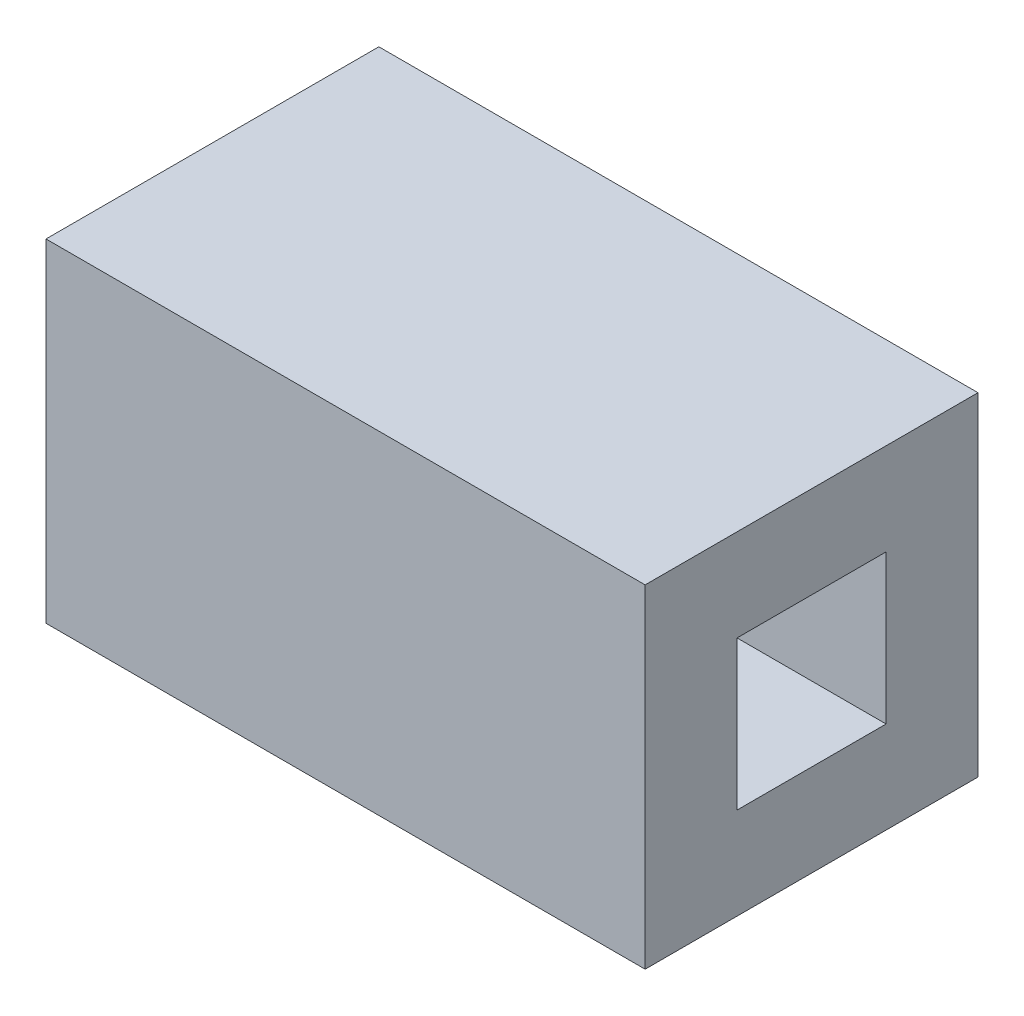
ISO-10303-21;
HEADER;
FILE_DESCRIPTION(('STEP AP214'),'2;1');
FILE_NAME('part.step','',(''),(''),'','','');
FILE_SCHEMA(('AUTOMOTIVE_DESIGN { 1 0 10303 214 1 1 1 1 }'));
ENDSEC;
DATA;
#1=APPLICATION_CONTEXT('core data for automotive mechanical design processes');
#2=APPLICATION_PROTOCOL_DEFINITION('international standard','automotive_design',2000,#1);
#3=PRODUCT_CONTEXT('',#1,'mechanical');
#4=PRODUCT('Part','Part','',(#3));
#5=PRODUCT_RELATED_PRODUCT_CATEGORY('part','',(#4));
#6=PRODUCT_DEFINITION_FORMATION('','',#4);
#7=PRODUCT_DEFINITION_CONTEXT('part definition',#1,'design');
#8=PRODUCT_DEFINITION('design','',#6,#7);
#9=PRODUCT_DEFINITION_SHAPE('','',#8);
#10=(LENGTH_UNIT() NAMED_UNIT(*) SI_UNIT(.MILLI.,.METRE.));
#11=(NAMED_UNIT(*) PLANE_ANGLE_UNIT() SI_UNIT($,.RADIAN.));
#12=(NAMED_UNIT(*) SI_UNIT($,.STERADIAN.) SOLID_ANGLE_UNIT());
#13=UNCERTAINTY_MEASURE_WITH_UNIT(LENGTH_MEASURE(1.E-05),#10,'distance_accuracy_value','');
#14=(GEOMETRIC_REPRESENTATION_CONTEXT(3) GLOBAL_UNCERTAINTY_ASSIGNED_CONTEXT((#13)) GLOBAL_UNIT_ASSIGNED_CONTEXT((#10,
#11,#12)) REPRESENTATION_CONTEXT('',''));
#15=CARTESIAN_POINT('',(0.,0.,0.));
#16=DIRECTION('',(0.,0.,1.));
#17=DIRECTION('',(1.,0.,0.));
#18=AXIS2_PLACEMENT_3D('',#15,#16,#17);
#19=CARTESIAN_POINT('',(-7.,0.,-3.75));
#20=DIRECTION('',(0.,0.,-1.));
#21=DIRECTION('',(-1.,0.,0.));
#22=AXIS2_PLACEMENT_3D('',#19,#20,#21);
#23=PLANE('',#22);
#24=DIRECTION('',(1.,0.,0.));
#25=VECTOR('',#24,1.);
#26=CARTESIAN_POINT('',(-7.,3.75,-3.75));
#27=LINE('',#26,#25);
#28=CARTESIAN_POINT('',(-7.,3.75,-3.75));
#29=VERTEX_POINT('',#28);
#30=CARTESIAN_POINT('',(6.5,3.75,-3.75));
#31=VERTEX_POINT('',#30);
#32=EDGE_CURVE('E50',#29,#31,#27,.T.);
#33=ORIENTED_EDGE('',*,*,#32,.T.);
#34=DIRECTION('',(0.,1.,0.));
#35=VECTOR('',#34,1.);
#36=CARTESIAN_POINT('',(6.5,-3.75,-3.75));
#37=LINE('',#36,#35);
#38=CARTESIAN_POINT('',(6.5,-3.75,-3.75));
#39=VERTEX_POINT('',#38);
#40=EDGE_CURVE('E172',#39,#31,#37,.T.);
#41=ORIENTED_EDGE('',*,*,#40,.F.);
#42=DIRECTION('',(1.,0.,0.));
#43=VECTOR('',#42,1.);
#44=CARTESIAN_POINT('',(-7.,-3.75,-3.75));
#45=LINE('',#44,#43);
#46=CARTESIAN_POINT('',(-7.,-3.75,-3.75));
#47=VERTEX_POINT('',#46);
#48=EDGE_CURVE('E11',#47,#39,#45,.T.);
#49=ORIENTED_EDGE('',*,*,#48,.F.);
#50=DIRECTION('',(0.,1.,0.));
#51=VECTOR('',#50,1.);
#52=CARTESIAN_POINT('',(-7.,0.,-3.75));
#53=LINE('',#52,#51);
#54=EDGE_CURVE('E176',#47,#29,#53,.T.);
#55=ORIENTED_EDGE('',*,*,#54,.T.);
#56=EDGE_LOOP('',(#33,#41,#49,#55));
#57=FACE_BOUND('',#56,.T.);
#58=ADVANCED_FACE('F47',(#57),#23,.T.);
#59=CARTESIAN_POINT('',(-7.,-3.75,0.));
#60=DIRECTION('',(0.,1.,0.));
#61=DIRECTION('',(0.,0.,1.));
#62=AXIS2_PLACEMENT_3D('',#59,#60,#61);
#63=PLANE('',#62);
#64=ORIENTED_EDGE('',*,*,#48,.T.);
#65=DIRECTION('',(0.,0.,-1.));
#66=VECTOR('',#65,1.);
#67=CARTESIAN_POINT('',(6.5,-3.75,-3.75));
#68=LINE('',#67,#66);
#69=CARTESIAN_POINT('',(6.5,-3.75,3.75));
#70=VERTEX_POINT('',#69);
#71=EDGE_CURVE('E168',#70,#39,#68,.T.);
#72=ORIENTED_EDGE('',*,*,#71,.F.);
#73=DIRECTION('',(1.,0.,0.));
#74=VECTOR('',#73,1.);
#75=CARTESIAN_POINT('',(-7.,-3.75,3.75));
#76=LINE('',#75,#74);
#77=CARTESIAN_POINT('',(-7.,-3.75,3.75));
#78=VERTEX_POINT('',#77);
#79=EDGE_CURVE('E56',#78,#70,#76,.T.);
#80=ORIENTED_EDGE('',*,*,#79,.F.);
#81=DIRECTION('',(0.,0.,1.));
#82=VECTOR('',#81,1.);
#83=CARTESIAN_POINT('',(-7.,-3.75,0.));
#84=LINE('',#83,#82);
#85=EDGE_CURVE('E187',#47,#78,#84,.T.);
#86=ORIENTED_EDGE('',*,*,#85,.F.);
#87=EDGE_LOOP('',(#64,#72,#80,#86));
#88=FACE_BOUND('',#87,.T.);
#89=ADVANCED_FACE('F215',(#88),#63,.F.);
#90=CARTESIAN_POINT('',(-7.,0.,3.75));
#91=DIRECTION('',(0.,0.,-1.));
#92=DIRECTION('',(-1.,0.,0.));
#93=AXIS2_PLACEMENT_3D('',#90,#91,#92);
#94=PLANE('',#93);
#95=ORIENTED_EDGE('',*,*,#79,.T.);
#96=DIRECTION('',(0.,-1.,0.));
#97=VECTOR('',#96,1.);
#98=CARTESIAN_POINT('',(6.5,-3.75,3.75));
#99=LINE('',#98,#97);
#100=CARTESIAN_POINT('',(6.5,3.75,3.75));
#101=VERTEX_POINT('',#100);
#102=EDGE_CURVE('E164',#101,#70,#99,.T.);
#103=ORIENTED_EDGE('',*,*,#102,.F.);
#104=DIRECTION('',(1.,0.,0.));
#105=VECTOR('',#104,1.);
#106=CARTESIAN_POINT('',(-7.,3.75,3.75));
#107=LINE('',#106,#105);
#108=CARTESIAN_POINT('',(-7.,3.75,3.75));
#109=VERTEX_POINT('',#108);
#110=EDGE_CURVE('E191',#109,#101,#107,.T.);
#111=ORIENTED_EDGE('',*,*,#110,.F.);
#112=DIRECTION('',(0.,1.,0.));
#113=VECTOR('',#112,1.);
#114=CARTESIAN_POINT('',(-7.,0.,3.75));
#115=LINE('',#114,#113);
#116=EDGE_CURVE('E184',#78,#109,#115,.T.);
#117=ORIENTED_EDGE('',*,*,#116,.F.);
#118=EDGE_LOOP('',(#95,#103,#111,#117));
#119=FACE_BOUND('',#118,.T.);
#120=ADVANCED_FACE('F207',(#119),#94,.F.);
#121=CARTESIAN_POINT('',(-7.,3.75,0.));
#122=DIRECTION('',(0.,1.,0.));
#123=DIRECTION('',(0.,0.,1.));
#124=AXIS2_PLACEMENT_3D('',#121,#122,#123);
#125=PLANE('',#124);
#126=ORIENTED_EDGE('',*,*,#110,.T.);
#127=DIRECTION('',(0.,0.,1.));
#128=VECTOR('',#127,1.);
#129=CARTESIAN_POINT('',(6.5,3.75,-3.75));
#130=LINE('',#129,#128);
#131=EDGE_CURVE('E129',#31,#101,#130,.T.);
#132=ORIENTED_EDGE('',*,*,#131,.F.);
#133=ORIENTED_EDGE('',*,*,#32,.F.);
#134=DIRECTION('',(0.,0.,1.));
#135=VECTOR('',#134,1.);
#136=CARTESIAN_POINT('',(-7.,3.75,0.));
#137=LINE('',#136,#135);
#138=EDGE_CURVE('E180',#29,#109,#137,.T.);
#139=ORIENTED_EDGE('',*,*,#138,.T.);
#140=EDGE_LOOP('',(#126,#132,#133,#139));
#141=FACE_BOUND('',#140,.T.);
#142=ADVANCED_FACE('F204',(#141),#125,.T.);
#143=CARTESIAN_POINT('',(-7.,0.,0.));
#144=DIRECTION('',(1.,0.,0.));
#145=DIRECTION('',(0.,0.,-1.));
#146=AXIS2_PLACEMENT_3D('',#143,#144,#145);
#147=PLANE('',#146);
#148=ORIENTED_EDGE('',*,*,#54,.F.);
#149=ORIENTED_EDGE('',*,*,#85,.T.);
#150=ORIENTED_EDGE('',*,*,#116,.T.);
#151=ORIENTED_EDGE('',*,*,#138,.F.);
#152=EDGE_LOOP('',(#148,#149,#150,#151));
#153=FACE_BOUND('',#152,.T.);
#154=ADVANCED_FACE('F206',(#153),#147,.F.);
#155=CARTESIAN_POINT('',(6.5,0.,0.));
#156=DIRECTION('',(-1.,0.,0.));
#157=DIRECTION('',(0.,0.,1.));
#158=AXIS2_PLACEMENT_3D('',#155,#156,#157);
#159=PLANE('',#158);
#160=ORIENTED_EDGE('',*,*,#131,.T.);
#161=ORIENTED_EDGE('',*,*,#102,.T.);
#162=ORIENTED_EDGE('',*,*,#71,.T.);
#163=ORIENTED_EDGE('',*,*,#40,.T.);
#164=EDGE_LOOP('',(#160,#161,#162,#163));
#165=FACE_BOUND('',#164,.T.);
#166=DIRECTION('',(0.,0.,1.));
#167=VECTOR('',#166,1.);
#168=CARTESIAN_POINT('',(6.5,1.67937860531805,-1.67937860531805));
#169=LINE('',#168,#167);
#170=CARTESIAN_POINT('',(6.5,1.67937860531805,-1.67937860531805));
#171=VERTEX_POINT('',#170);
#172=CARTESIAN_POINT('',(6.5,1.67937860531805,1.67937860531805));
#173=VERTEX_POINT('',#172);
#174=EDGE_CURVE('E112',#171,#173,#169,.T.);
#175=ORIENTED_EDGE('',*,*,#174,.F.);
#176=DIRECTION('',(0.,1.,0.));
#177=VECTOR('',#176,1.);
#178=CARTESIAN_POINT('',(6.5,-1.67937860531805,-1.67937860531805));
#179=LINE('',#178,#177);
#180=CARTESIAN_POINT('',(6.5,-1.67937860531805,-1.67937860531805));
#181=VERTEX_POINT('',#180);
#182=EDGE_CURVE('E139',#181,#171,#179,.T.);
#183=ORIENTED_EDGE('',*,*,#182,.F.);
#184=DIRECTION('',(0.,0.,-1.));
#185=VECTOR('',#184,1.);
#186=CARTESIAN_POINT('',(6.5,-1.67937860531805,-1.67937860531805));
#187=LINE('',#186,#185);
#188=CARTESIAN_POINT('',(6.5,-1.67937860531805,1.67937860531805));
#189=VERTEX_POINT('',#188);
#190=EDGE_CURVE('E135',#189,#181,#187,.T.);
#191=ORIENTED_EDGE('',*,*,#190,.F.);
#192=DIRECTION('',(0.,-1.,0.));
#193=VECTOR('',#192,1.);
#194=CARTESIAN_POINT('',(6.5,-1.67937860531805,1.67937860531805));
#195=LINE('',#194,#193);
#196=EDGE_CURVE('E122',#173,#189,#195,.T.);
#197=ORIENTED_EDGE('',*,*,#196,.F.);
#198=EDGE_LOOP('',(#175,#183,#191,#197));
#199=FACE_BOUND('',#198,.T.);
#200=ADVANCED_FACE('F133',(#165,#199),#159,.F.);
#201=CARTESIAN_POINT('',(6.5,1.67937860531805,-1.67937860531805));
#202=DIRECTION('',(0.,-1.,0.));
#203=DIRECTION('',(0.,0.,-1.));
#204=AXIS2_PLACEMENT_3D('',#201,#202,#203);
#205=PLANE('',#204);
#206=DIRECTION('',(0.,0.,1.));
#207=VECTOR('',#206,1.);
#208=CARTESIAN_POINT('',(0.,1.67937860531805,-1.67937860531805));
#209=LINE('',#208,#207);
#210=CARTESIAN_POINT('',(0.,1.67937860531805,-1.67937860531805));
#211=VERTEX_POINT('',#210);
#212=CARTESIAN_POINT('',(0.,1.67937860531805,1.67937860531805));
#213=VERTEX_POINT('',#212);
#214=EDGE_CURVE('E64',#211,#213,#209,.T.);
#215=ORIENTED_EDGE('',*,*,#214,.F.);
#216=DIRECTION('',(-1.,0.,0.));
#217=VECTOR('',#216,1.);
#218=CARTESIAN_POINT('',(6.5,1.67937860531805,-1.67937860531805));
#219=LINE('',#218,#217);
#220=EDGE_CURVE('E117',#171,#211,#219,.T.);
#221=ORIENTED_EDGE('',*,*,#220,.F.);
#222=ORIENTED_EDGE('',*,*,#174,.T.);
#223=DIRECTION('',(-1.,0.,0.));
#224=VECTOR('',#223,1.);
#225=CARTESIAN_POINT('',(6.5,1.67937860531805,1.67937860531805));
#226=LINE('',#225,#224);
#227=EDGE_CURVE('E115',#173,#213,#226,.T.);
#228=ORIENTED_EDGE('',*,*,#227,.T.);
#229=EDGE_LOOP('',(#215,#221,#222,#228));
#230=FACE_BOUND('',#229,.T.);
#231=ADVANCED_FACE('F114',(#230),#205,.T.);
#232=CARTESIAN_POINT('',(6.5,-1.67937860531805,1.67937860531805));
#233=DIRECTION('',(0.,0.,-1.));
#234=DIRECTION('',(-1.,0.,0.));
#235=AXIS2_PLACEMENT_3D('',#232,#233,#234);
#236=PLANE('',#235);
#237=DIRECTION('',(0.,-1.,0.));
#238=VECTOR('',#237,1.);
#239=CARTESIAN_POINT('',(0.,-1.67937860531805,1.67937860531805));
#240=LINE('',#239,#238);
#241=CARTESIAN_POINT('',(0.,-1.67937860531805,1.67937860531805));
#242=VERTEX_POINT('',#241);
#243=EDGE_CURVE('E68',#213,#242,#240,.T.);
#244=ORIENTED_EDGE('',*,*,#243,.F.);
#245=ORIENTED_EDGE('',*,*,#227,.F.);
#246=ORIENTED_EDGE('',*,*,#196,.T.);
#247=DIRECTION('',(-1.,0.,0.));
#248=VECTOR('',#247,1.);
#249=CARTESIAN_POINT('',(6.5,-1.67937860531805,1.67937860531805));
#250=LINE('',#249,#248);
#251=EDGE_CURVE('E130',#189,#242,#250,.T.);
#252=ORIENTED_EDGE('',*,*,#251,.T.);
#253=EDGE_LOOP('',(#244,#245,#246,#252));
#254=FACE_BOUND('',#253,.T.);
#255=ADVANCED_FACE('F126',(#254),#236,.T.);
#256=CARTESIAN_POINT('',(6.5,-1.67937860531805,-1.67937860531805));
#257=DIRECTION('',(0.,1.,0.));
#258=DIRECTION('',(0.,0.,1.));
#259=AXIS2_PLACEMENT_3D('',#256,#257,#258);
#260=PLANE('',#259);
#261=DIRECTION('',(0.,0.,-1.));
#262=VECTOR('',#261,1.);
#263=CARTESIAN_POINT('',(0.,-1.67937860531805,-1.67937860531805));
#264=LINE('',#263,#262);
#265=CARTESIAN_POINT('',(0.,-1.67937860531805,-1.67937860531805));
#266=VERTEX_POINT('',#265);
#267=EDGE_CURVE('E148',#242,#266,#264,.T.);
#268=ORIENTED_EDGE('',*,*,#267,.F.);
#269=ORIENTED_EDGE('',*,*,#251,.F.);
#270=ORIENTED_EDGE('',*,*,#190,.T.);
#271=DIRECTION('',(-1.,0.,0.));
#272=VECTOR('',#271,1.);
#273=CARTESIAN_POINT('',(6.5,-1.67937860531805,-1.67937860531805));
#274=LINE('',#273,#272);
#275=EDGE_CURVE('E155',#181,#266,#274,.T.);
#276=ORIENTED_EDGE('',*,*,#275,.T.);
#277=EDGE_LOOP('',(#268,#269,#270,#276));
#278=FACE_BOUND('',#277,.T.);
#279=ADVANCED_FACE('F236',(#278),#260,.T.);
#280=CARTESIAN_POINT('',(6.5,-1.67937860531805,-1.67937860531805));
#281=DIRECTION('',(0.,0.,1.));
#282=DIRECTION('',(1.,0.,0.));
#283=AXIS2_PLACEMENT_3D('',#280,#281,#282);
#284=PLANE('',#283);
#285=DIRECTION('',(0.,1.,0.));
#286=VECTOR('',#285,1.);
#287=CARTESIAN_POINT('',(0.,-1.67937860531805,-1.67937860531805));
#288=LINE('',#287,#286);
#289=EDGE_CURVE('E123',#266,#211,#288,.T.);
#290=ORIENTED_EDGE('',*,*,#289,.F.);
#291=ORIENTED_EDGE('',*,*,#275,.F.);
#292=ORIENTED_EDGE('',*,*,#182,.T.);
#293=ORIENTED_EDGE('',*,*,#220,.T.);
#294=EDGE_LOOP('',(#290,#291,#292,#293));
#295=FACE_BOUND('',#294,.T.);
#296=ADVANCED_FACE('F229',(#295),#284,.T.);
#297=CARTESIAN_POINT('',(0.,0.,0.));
#298=DIRECTION('',(1.,0.,0.));
#299=DIRECTION('',(0.,0.,-1.));
#300=AXIS2_PLACEMENT_3D('',#297,#298,#299);
#301=PLANE('',#300);
#302=ORIENTED_EDGE('',*,*,#214,.T.);
#303=ORIENTED_EDGE('',*,*,#243,.T.);
#304=ORIENTED_EDGE('',*,*,#267,.T.);
#305=ORIENTED_EDGE('',*,*,#289,.T.);
#306=EDGE_LOOP('',(#302,#303,#304,#305));
#307=FACE_BOUND('',#306,.T.);
#308=ADVANCED_FACE('F227',(#307),#301,.T.);
#309=CLOSED_SHELL('',(#58,#89,#120,#142,#154,#200,#231,#255,#279,#296,#308));
#310=MANIFOLD_SOLID_BREP('B2',#309);
#311=ADVANCED_BREP_SHAPE_REPRESENTATION('',(#18,#310),#14);
#312=SHAPE_DEFINITION_REPRESENTATION(#9,#311);
ENDSEC;
END-ISO-10303-21;
